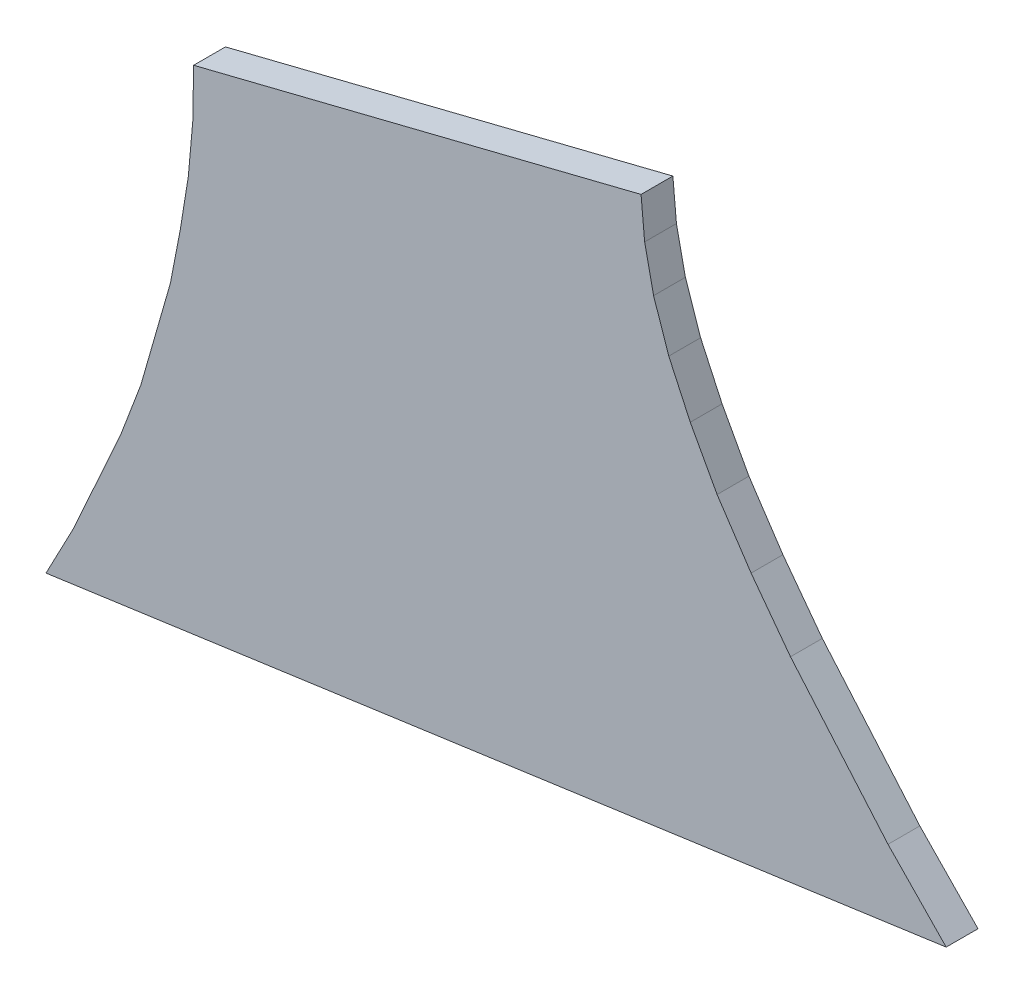
ISO-10303-21;
HEADER;
FILE_DESCRIPTION(('STEP AP214'),'2;1');
FILE_NAME('part.step','',(''),(''),'','','');
FILE_SCHEMA(('AUTOMOTIVE_DESIGN { 1 0 10303 214 1 1 1 1 }'));
ENDSEC;
DATA;
#1=APPLICATION_CONTEXT('core data for automotive mechanical design processes');
#2=APPLICATION_PROTOCOL_DEFINITION('international standard','automotive_design',2000,#1);
#3=PRODUCT_CONTEXT('',#1,'mechanical');
#4=PRODUCT('Part','Part','',(#3));
#5=PRODUCT_RELATED_PRODUCT_CATEGORY('part','',(#4));
#6=PRODUCT_DEFINITION_FORMATION('','',#4);
#7=PRODUCT_DEFINITION_CONTEXT('part definition',#1,'design');
#8=PRODUCT_DEFINITION('design','',#6,#7);
#9=PRODUCT_DEFINITION_SHAPE('','',#8);
#10=(LENGTH_UNIT() NAMED_UNIT(*) SI_UNIT(.MILLI.,.METRE.));
#11=(NAMED_UNIT(*) PLANE_ANGLE_UNIT() SI_UNIT($,.RADIAN.));
#12=(NAMED_UNIT(*) SI_UNIT($,.STERADIAN.) SOLID_ANGLE_UNIT());
#13=UNCERTAINTY_MEASURE_WITH_UNIT(LENGTH_MEASURE(1.E-05),#10,'distance_accuracy_value','');
#14=(GEOMETRIC_REPRESENTATION_CONTEXT(3) GLOBAL_UNCERTAINTY_ASSIGNED_CONTEXT((#13)) GLOBAL_UNIT_ASSIGNED_CONTEXT((#10,
#11,#12)) REPRESENTATION_CONTEXT('',''));
#15=CARTESIAN_POINT('',(0.,0.,0.));
#16=DIRECTION('',(0.,0.,1.));
#17=DIRECTION('',(1.,0.,0.));
#18=AXIS2_PLACEMENT_3D('',#15,#16,#17);
#19=CARTESIAN_POINT('',(88.6480026245117,106.698997497559,0.));
#20=DIRECTION('',(0.999834934997041,-0.0181687302655864,0.));
#21=DIRECTION('',(-0.0181687302655864,-0.999834934997041,0.));
#22=AXIS2_PLACEMENT_3D('',#19,#20,#21);
#23=PLANE('',#22);
#24=DIRECTION('',(-0.0181687302655864,-0.999834934997041,0.));
#25=VECTOR('',#24,1.);
#26=CARTESIAN_POINT('',(88.6480026245117,106.698997497559,0.03556));
#27=LINE('',#26,#25);
#28=CARTESIAN_POINT('',(88.6480026245117,106.698997497559,0.03556));
#29=VERTEX_POINT('',#28);
#30=CARTESIAN_POINT('',(88.6470031738281,106.643997192383,0.03556));
#31=VERTEX_POINT('',#30);
#32=EDGE_CURVE('E11',#29,#31,#27,.T.);
#33=ORIENTED_EDGE('',*,*,#32,.F.);
#34=DIRECTION('',(0.,0.,1.));
#35=VECTOR('',#34,1.);
#36=CARTESIAN_POINT('',(88.6480026245117,106.698997497559,0.));
#37=LINE('',#36,#35);
#38=CARTESIAN_POINT('',(88.6480026245117,106.698997497559,0.));
#39=VERTEX_POINT('',#38);
#40=EDGE_CURVE('E24',#39,#29,#37,.T.);
#41=ORIENTED_EDGE('',*,*,#40,.F.);
#42=DIRECTION('',(-0.0181687302655864,-0.999834934997041,0.));
#43=VECTOR('',#42,1.);
#44=CARTESIAN_POINT('',(88.6480026245117,106.698997497559,0.));
#45=LINE('',#44,#43);
#46=CARTESIAN_POINT('',(88.6470031738281,106.643997192383,0.));
#47=VERTEX_POINT('',#46);
#48=EDGE_CURVE('E166',#39,#47,#45,.T.);
#49=ORIENTED_EDGE('',*,*,#48,.T.);
#50=DIRECTION('',(0.,0.,1.));
#51=VECTOR('',#50,1.);
#52=CARTESIAN_POINT('',(88.6470031738281,106.643997192383,0.));
#53=LINE('',#52,#51);
#54=EDGE_CURVE('E37',#47,#31,#53,.T.);
#55=ORIENTED_EDGE('',*,*,#54,.T.);
#56=EDGE_LOOP('',(#33,#41,#49,#55));
#57=FACE_BOUND('',#56,.T.);
#58=ADVANCED_FACE('F17',(#57),#23,.F.);
#59=CARTESIAN_POINT('',(88.6470031738281,106.643997192383,0.));
#60=DIRECTION('',(0.996029974315315,-0.089018482718099,0.));
#61=DIRECTION('',(-0.089018482718099,-0.996029974315315,0.));
#62=AXIS2_PLACEMENT_3D('',#59,#60,#61);
#63=PLANE('',#62);
#64=DIRECTION('',(-0.089018482718099,-0.996029974315315,0.));
#65=VECTOR('',#64,1.);
#66=CARTESIAN_POINT('',(88.6470031738281,106.643997192383,0.03556));
#67=LINE('',#66,#65);
#68=CARTESIAN_POINT('',(88.6419982910156,106.587997436523,0.03556));
#69=VERTEX_POINT('',#68);
#70=EDGE_CURVE('E294',#31,#69,#67,.T.);
#71=ORIENTED_EDGE('',*,*,#70,.F.);
#72=ORIENTED_EDGE('',*,*,#54,.F.);
#73=DIRECTION('',(-0.089018482718099,-0.996029974315315,0.));
#74=VECTOR('',#73,1.);
#75=CARTESIAN_POINT('',(88.6470031738281,106.643997192383,0.));
#76=LINE('',#75,#74);
#77=CARTESIAN_POINT('',(88.6419982910156,106.587997436523,0.));
#78=VERTEX_POINT('',#77);
#79=EDGE_CURVE('E291',#47,#78,#76,.T.);
#80=ORIENTED_EDGE('',*,*,#79,.T.);
#81=DIRECTION('',(0.,0.,1.));
#82=VECTOR('',#81,1.);
#83=CARTESIAN_POINT('',(88.6419982910156,106.587997436523,0.));
#84=LINE('',#83,#82);
#85=EDGE_CURVE('E289',#78,#69,#84,.T.);
#86=ORIENTED_EDGE('',*,*,#85,.T.);
#87=EDGE_LOOP('',(#71,#72,#80,#86));
#88=FACE_BOUND('',#87,.T.);
#89=ADVANCED_FACE('F302',(#88),#63,.F.);
#90=CARTESIAN_POINT('',(88.6419982910156,106.587997436524,0.));
#91=DIRECTION('',(0.987343915402215,-0.158593797855478,0.));
#92=DIRECTION('',(-0.158593797855478,-0.987343915402215,0.));
#93=AXIS2_PLACEMENT_3D('',#90,#91,#92);
#94=PLANE('',#93);
#95=DIRECTION('',(-0.158593797855478,-0.987343915402215,0.));
#96=VECTOR('',#95,1.);
#97=CARTESIAN_POINT('',(88.6419982910156,106.587997436523,0.03556));
#98=LINE('',#97,#96);
#99=CARTESIAN_POINT('',(88.6330032348633,106.531997680664,0.03556));
#100=VERTEX_POINT('',#99);
#101=EDGE_CURVE('E286',#69,#100,#98,.T.);
#102=ORIENTED_EDGE('',*,*,#101,.F.);
#103=ORIENTED_EDGE('',*,*,#85,.F.);
#104=DIRECTION('',(-0.158593797855478,-0.987343915402215,0.));
#105=VECTOR('',#104,1.);
#106=CARTESIAN_POINT('',(88.6419982910156,106.587997436523,0.));
#107=LINE('',#106,#105);
#108=CARTESIAN_POINT('',(88.6330032348633,106.531997680664,0.));
#109=VERTEX_POINT('',#108);
#110=EDGE_CURVE('E283',#78,#109,#107,.T.);
#111=ORIENTED_EDGE('',*,*,#110,.T.);
#112=DIRECTION('',(0.,0.,1.));
#113=VECTOR('',#112,1.);
#114=CARTESIAN_POINT('',(88.6330032348633,106.531997680664,0.));
#115=LINE('',#114,#113);
#116=EDGE_CURVE('E281',#109,#100,#115,.T.);
#117=ORIENTED_EDGE('',*,*,#116,.T.);
#118=EDGE_LOOP('',(#102,#103,#111,#117));
#119=FACE_BOUND('',#118,.T.);
#120=ADVANCED_FACE('F308',(#119),#94,.F.);
#121=CARTESIAN_POINT('',(88.6330032348633,106.531997680664,0.));
#122=DIRECTION('',(0.981877794410834,-0.189515162567317,0.));
#123=DIRECTION('',(-0.189515162567317,-0.981877794410834,0.));
#124=AXIS2_PLACEMENT_3D('',#121,#122,#123);
#125=PLANE('',#124);
#126=DIRECTION('',(-0.189515162567317,-0.981877794410834,0.));
#127=VECTOR('',#126,1.);
#128=CARTESIAN_POINT('',(88.6330032348633,106.531997680664,0.03556));
#129=LINE('',#128,#127);
#130=CARTESIAN_POINT('',(88.6220016479492,106.474998474121,0.03556));
#131=VERTEX_POINT('',#130);
#132=EDGE_CURVE('E278',#100,#131,#129,.T.);
#133=ORIENTED_EDGE('',*,*,#132,.F.);
#134=ORIENTED_EDGE('',*,*,#116,.F.);
#135=DIRECTION('',(-0.189515162567317,-0.981877794410834,0.));
#136=VECTOR('',#135,1.);
#137=CARTESIAN_POINT('',(88.6330032348633,106.531997680664,0.));
#138=LINE('',#137,#136);
#139=CARTESIAN_POINT('',(88.6220016479492,106.474998474121,0.));
#140=VERTEX_POINT('',#139);
#141=EDGE_CURVE('E275',#109,#140,#138,.T.);
#142=ORIENTED_EDGE('',*,*,#141,.T.);
#143=DIRECTION('',(0.,0.,1.));
#144=VECTOR('',#143,1.);
#145=CARTESIAN_POINT('',(88.6220016479492,106.474998474121,0.));
#146=LINE('',#145,#144);
#147=EDGE_CURVE('E273',#140,#131,#146,.T.);
#148=ORIENTED_EDGE('',*,*,#147,.T.);
#149=EDGE_LOOP('',(#133,#134,#142,#148));
#150=FACE_BOUND('',#149,.T.);
#151=ADVANCED_FACE('F310',(#150),#125,.F.);
#152=CARTESIAN_POINT('',(88.6220016479492,106.474998474121,0.));
#153=DIRECTION('',(0.961195996054474,-0.275866375567681,0.));
#154=DIRECTION('',(-0.275866375567681,-0.961195996054474,0.));
#155=AXIS2_PLACEMENT_3D('',#152,#153,#154);
#156=PLANE('',#155);
#157=DIRECTION('',(-0.275866375567681,-0.961195996054473,0.));
#158=VECTOR('',#157,1.);
#159=CARTESIAN_POINT('',(88.6220016479492,106.474998474121,0.03556));
#160=LINE('',#159,#158);
#161=CARTESIAN_POINT('',(88.588996887207,106.360000610352,0.03556));
#162=VERTEX_POINT('',#161);
#163=EDGE_CURVE('E270',#131,#162,#160,.T.);
#164=ORIENTED_EDGE('',*,*,#163,.F.);
#165=ORIENTED_EDGE('',*,*,#147,.F.);
#166=DIRECTION('',(-0.275866375567681,-0.961195996054473,0.));
#167=VECTOR('',#166,1.);
#168=CARTESIAN_POINT('',(88.6220016479492,106.474998474121,0.));
#169=LINE('',#168,#167);
#170=CARTESIAN_POINT('',(88.588996887207,106.360000610352,0.));
#171=VERTEX_POINT('',#170);
#172=EDGE_CURVE('E267',#140,#171,#169,.T.);
#173=ORIENTED_EDGE('',*,*,#172,.T.);
#174=DIRECTION('',(0.,0.,1.));
#175=VECTOR('',#174,1.);
#176=CARTESIAN_POINT('',(88.588996887207,106.360000610352,0.));
#177=LINE('',#176,#175);
#178=EDGE_CURVE('E265',#171,#162,#177,.T.);
#179=ORIENTED_EDGE('',*,*,#178,.T.);
#180=EDGE_LOOP('',(#164,#165,#173,#179));
#181=FACE_BOUND('',#180,.T.);
#182=ADVANCED_FACE('F315',(#181),#156,.F.);
#183=CARTESIAN_POINT('',(88.588996887207,106.360000610352,0.));
#184=DIRECTION('',(0.935018620719502,-0.354598616618564,0.));
#185=DIRECTION('',(-0.354598616618564,-0.935018620719502,0.));
#186=AXIS2_PLACEMENT_3D('',#183,#184,#185);
#187=PLANE('',#186);
#188=DIRECTION('',(-0.354598616618564,-0.935018620719502,0.));
#189=VECTOR('',#188,1.);
#190=CARTESIAN_POINT('',(88.588996887207,106.360000610352,0.03556));
#191=LINE('',#190,#189);
#192=CARTESIAN_POINT('',(88.5670013427734,106.302001953125,0.03556));
#193=VERTEX_POINT('',#192);
#194=EDGE_CURVE('E262',#162,#193,#191,.T.);
#195=ORIENTED_EDGE('',*,*,#194,.F.);
#196=ORIENTED_EDGE('',*,*,#178,.F.);
#197=DIRECTION('',(-0.354598616618564,-0.935018620719502,0.));
#198=VECTOR('',#197,1.);
#199=CARTESIAN_POINT('',(88.588996887207,106.360000610352,0.));
#200=LINE('',#199,#198);
#201=CARTESIAN_POINT('',(88.5670013427734,106.302001953125,0.));
#202=VERTEX_POINT('',#201);
#203=EDGE_CURVE('E259',#171,#202,#200,.T.);
#204=ORIENTED_EDGE('',*,*,#203,.T.);
#205=DIRECTION('',(0.,0.,1.));
#206=VECTOR('',#205,1.);
#207=CARTESIAN_POINT('',(88.5670013427734,106.302001953125,0.));
#208=LINE('',#207,#206);
#209=EDGE_CURVE('E257',#202,#193,#208,.T.);
#210=ORIENTED_EDGE('',*,*,#209,.T.);
#211=EDGE_LOOP('',(#195,#196,#204,#210));
#212=FACE_BOUND('',#211,.T.);
#213=ADVANCED_FACE('F318',(#212),#187,.F.);
#214=CARTESIAN_POINT('',(88.5670013427734,106.302001953125,0.));
#215=DIRECTION('',(0.912211507330292,-0.409719618634741,0.));
#216=DIRECTION('',(-0.409719618634741,-0.912211507330292,0.));
#217=AXIS2_PLACEMENT_3D('',#214,#215,#216);
#218=PLANE('',#217);
#219=DIRECTION('',(-0.409719618634741,-0.912211507330292,0.));
#220=VECTOR('',#219,1.);
#221=CARTESIAN_POINT('',(88.5670013427734,106.302001953125,0.03556));
#222=LINE('',#221,#220);
#223=CARTESIAN_POINT('',(88.5139999389648,106.18399810791,0.03556));
#224=VERTEX_POINT('',#223);
#225=EDGE_CURVE('E254',#193,#224,#222,.T.);
#226=ORIENTED_EDGE('',*,*,#225,.F.);
#227=ORIENTED_EDGE('',*,*,#209,.F.);
#228=DIRECTION('',(-0.409719618634741,-0.912211507330292,0.));
#229=VECTOR('',#228,1.);
#230=CARTESIAN_POINT('',(88.5670013427734,106.302001953125,0.));
#231=LINE('',#230,#229);
#232=CARTESIAN_POINT('',(88.5139999389648,106.18399810791,0.));
#233=VERTEX_POINT('',#232);
#234=EDGE_CURVE('E251',#202,#233,#231,.T.);
#235=ORIENTED_EDGE('',*,*,#234,.T.);
#236=DIRECTION('',(0.,0.,1.));
#237=VECTOR('',#236,1.);
#238=CARTESIAN_POINT('',(88.5139999389648,106.18399810791,0.));
#239=LINE('',#238,#237);
#240=EDGE_CURVE('E249',#233,#224,#239,.T.);
#241=ORIENTED_EDGE('',*,*,#240,.T.);
#242=EDGE_LOOP('',(#226,#227,#235,#241));
#243=FACE_BOUND('',#242,.T.);
#244=ADVANCED_FACE('F323',(#243),#218,.F.);
#245=CARTESIAN_POINT('',(88.5139999389648,106.18399810791,0.));
#246=DIRECTION('',(0.885248268877242,-0.465118804661611,0.));
#247=DIRECTION('',(-0.465118804661611,-0.885248268877242,0.));
#248=AXIS2_PLACEMENT_3D('',#245,#246,#247);
#249=PLANE('',#248);
#250=DIRECTION('',(-0.465118804661611,-0.885248268877242,0.));
#251=VECTOR('',#250,1.);
#252=CARTESIAN_POINT('',(88.5139999389648,106.18399810791,0.03556));
#253=LINE('',#252,#251);
#254=CARTESIAN_POINT('',(88.4830017089844,106.125,0.03556));
#255=VERTEX_POINT('',#254);
#256=EDGE_CURVE('E246',#224,#255,#253,.T.);
#257=ORIENTED_EDGE('',*,*,#256,.F.);
#258=ORIENTED_EDGE('',*,*,#240,.F.);
#259=DIRECTION('',(-0.465118804661611,-0.885248268877242,0.));
#260=VECTOR('',#259,1.);
#261=CARTESIAN_POINT('',(88.5139999389648,106.18399810791,0.));
#262=LINE('',#261,#260);
#263=CARTESIAN_POINT('',(88.4830017089844,106.125,0.));
#264=VERTEX_POINT('',#263);
#265=EDGE_CURVE('E243',#233,#264,#262,.T.);
#266=ORIENTED_EDGE('',*,*,#265,.T.);
#267=DIRECTION('',(0.,0.,1.));
#268=VECTOR('',#267,1.);
#269=CARTESIAN_POINT('',(88.4830017089844,106.125,0.));
#270=LINE('',#269,#268);
#271=EDGE_CURVE('E241',#264,#255,#270,.T.);
#272=ORIENTED_EDGE('',*,*,#271,.T.);
#273=EDGE_LOOP('',(#257,#258,#266,#272));
#274=FACE_BOUND('',#273,.T.);
#275=ADVANCED_FACE('F326',(#274),#249,.F.);
#276=CARTESIAN_POINT('',(88.4830017089844,106.125,0.));
#277=DIRECTION('',(-0.138801647638479,0.990320202062365,0.));
#278=DIRECTION('',(0.990320202062365,0.138801647638479,0.));
#279=AXIS2_PLACEMENT_3D('',#276,#277,#278);
#280=PLANE('',#279);
#281=DIRECTION('',(0.990320202062365,0.138801647638479,0.));
#282=VECTOR('',#281,1.);
#283=CARTESIAN_POINT('',(88.4830017089844,106.125,0.03556));
#284=LINE('',#283,#282);
#285=CARTESIAN_POINT('',(89.4889984130859,106.265998840332,0.03556));
#286=VERTEX_POINT('',#285);
#287=EDGE_CURVE('E238',#255,#286,#284,.T.);
#288=ORIENTED_EDGE('',*,*,#287,.F.);
#289=ORIENTED_EDGE('',*,*,#271,.F.);
#290=DIRECTION('',(0.990320202062365,0.138801647638479,0.));
#291=VECTOR('',#290,1.);
#292=CARTESIAN_POINT('',(88.4830017089844,106.125,0.));
#293=LINE('',#292,#291);
#294=CARTESIAN_POINT('',(89.4889984130859,106.265998840332,0.));
#295=VERTEX_POINT('',#294);
#296=EDGE_CURVE('E235',#264,#295,#293,.T.);
#297=ORIENTED_EDGE('',*,*,#296,.T.);
#298=DIRECTION('',(0.,0.,1.));
#299=VECTOR('',#298,1.);
#300=CARTESIAN_POINT('',(89.4889984130859,106.265998840332,0.));
#301=LINE('',#300,#299);
#302=EDGE_CURVE('E233',#295,#286,#301,.T.);
#303=ORIENTED_EDGE('',*,*,#302,.T.);
#304=EDGE_LOOP('',(#288,#289,#297,#303));
#305=FACE_BOUND('',#304,.T.);
#306=ADVANCED_FACE('F331',(#305),#280,.F.);
#307=CARTESIAN_POINT('',(89.4889984130859,106.265998840332,0.));
#308=DIRECTION('',(-0.71777288988445,-0.696277300037079,0.));
#309=DIRECTION('',(-0.696277300037079,0.71777288988445,0.));
#310=AXIS2_PLACEMENT_3D('',#307,#308,#309);
#311=PLANE('',#310);
#312=DIRECTION('',(-0.696277300037079,0.71777288988445,0.));
#313=VECTOR('',#312,1.);
#314=CARTESIAN_POINT('',(89.4889984130859,106.265998840332,0.03556));
#315=LINE('',#314,#313);
#316=CARTESIAN_POINT('',(89.4240036010742,106.333000183105,0.03556));
#317=VERTEX_POINT('',#316);
#318=EDGE_CURVE('E230',#286,#317,#315,.T.);
#319=ORIENTED_EDGE('',*,*,#318,.F.);
#320=ORIENTED_EDGE('',*,*,#302,.F.);
#321=DIRECTION('',(-0.696277300037079,0.71777288988445,0.));
#322=VECTOR('',#321,1.);
#323=CARTESIAN_POINT('',(89.4889984130859,106.265998840332,0.));
#324=LINE('',#323,#322);
#325=CARTESIAN_POINT('',(89.4240036010742,106.333000183105,0.));
#326=VERTEX_POINT('',#325);
#327=EDGE_CURVE('E227',#295,#326,#324,.T.);
#328=ORIENTED_EDGE('',*,*,#327,.T.);
#329=DIRECTION('',(0.,0.,1.));
#330=VECTOR('',#329,1.);
#331=CARTESIAN_POINT('',(89.4240036010742,106.333000183105,0.));
#332=LINE('',#331,#330);
#333=EDGE_CURVE('E225',#326,#317,#332,.T.);
#334=ORIENTED_EDGE('',*,*,#333,.T.);
#335=EDGE_LOOP('',(#319,#320,#328,#334));
#336=FACE_BOUND('',#335,.T.);
#337=ADVANCED_FACE('F334',(#336),#311,.F.);
#338=CARTESIAN_POINT('',(89.4240036010742,106.333000183105,0.));
#339=DIRECTION('',(-0.758828463890867,-0.65129053608127,0.));
#340=DIRECTION('',(-0.65129053608127,0.758828463890867,0.));
#341=AXIS2_PLACEMENT_3D('',#338,#339,#340);
#342=PLANE('',#341);
#343=DIRECTION('',(-0.65129053608127,0.758828463890867,0.));
#344=VECTOR('',#343,1.);
#345=CARTESIAN_POINT('',(89.4240036010742,106.333000183105,0.03556));
#346=LINE('',#345,#344);
#347=CARTESIAN_POINT('',(89.3150024414062,106.459999084473,0.03556));
#348=VERTEX_POINT('',#347);
#349=EDGE_CURVE('E222',#317,#348,#346,.T.);
#350=ORIENTED_EDGE('',*,*,#349,.F.);
#351=ORIENTED_EDGE('',*,*,#333,.F.);
#352=DIRECTION('',(-0.65129053608127,0.758828463890867,0.));
#353=VECTOR('',#352,1.);
#354=CARTESIAN_POINT('',(89.4240036010742,106.333000183105,0.));
#355=LINE('',#354,#353);
#356=CARTESIAN_POINT('',(89.3150024414062,106.459999084473,0.));
#357=VERTEX_POINT('',#356);
#358=EDGE_CURVE('E219',#326,#357,#355,.T.);
#359=ORIENTED_EDGE('',*,*,#358,.T.);
#360=DIRECTION('',(0.,0.,1.));
#361=VECTOR('',#360,1.);
#362=CARTESIAN_POINT('',(89.3150024414062,106.459999084473,0.));
#363=LINE('',#362,#361);
#364=EDGE_CURVE('E217',#357,#348,#363,.T.);
#365=ORIENTED_EDGE('',*,*,#364,.T.);
#366=EDGE_LOOP('',(#350,#351,#359,#365));
#367=FACE_BOUND('',#366,.T.);
#368=ADVANCED_FACE('F339',(#367),#342,.F.);
#369=CARTESIAN_POINT('',(89.3150024414062,106.459999084473,0.));
#370=DIRECTION('',(-0.80162663308087,-0.597825008790557,0.));
#371=DIRECTION('',(-0.597825008790557,0.80162663308087,0.));
#372=AXIS2_PLACEMENT_3D('',#369,#370,#371);
#373=PLANE('',#372);
#374=DIRECTION('',(-0.597825008790557,0.80162663308087,0.));
#375=VECTOR('',#374,1.);
#376=CARTESIAN_POINT('',(89.3150024414062,106.459999084473,0.03556));
#377=LINE('',#376,#375);
#378=CARTESIAN_POINT('',(89.2710037231445,106.518997192383,0.03556));
#379=VERTEX_POINT('',#378);
#380=EDGE_CURVE('E214',#348,#379,#377,.T.);
#381=ORIENTED_EDGE('',*,*,#380,.F.);
#382=ORIENTED_EDGE('',*,*,#364,.F.);
#383=DIRECTION('',(-0.597825008790557,0.80162663308087,0.));
#384=VECTOR('',#383,1.);
#385=CARTESIAN_POINT('',(89.3150024414062,106.459999084473,0.));
#386=LINE('',#385,#384);
#387=CARTESIAN_POINT('',(89.2710037231445,106.518997192383,0.));
#388=VERTEX_POINT('',#387);
#389=EDGE_CURVE('E211',#357,#388,#386,.T.);
#390=ORIENTED_EDGE('',*,*,#389,.T.);
#391=DIRECTION('',(0.,0.,1.));
#392=VECTOR('',#391,1.);
#393=CARTESIAN_POINT('',(89.2710037231445,106.518997192383,0.));
#394=LINE('',#393,#392);
#395=EDGE_CURVE('E209',#388,#379,#394,.T.);
#396=ORIENTED_EDGE('',*,*,#395,.T.);
#397=EDGE_LOOP('',(#381,#382,#390,#396));
#398=FACE_BOUND('',#397,.T.);
#399=ADVANCED_FACE('F342',(#398),#373,.F.);
#400=CARTESIAN_POINT('',(89.2710037231445,106.518997192383,0.));
#401=DIRECTION('',(-0.83203316034414,-0.554725896355797,0.));
#402=DIRECTION('',(-0.554725896355797,0.83203316034414,0.));
#403=AXIS2_PLACEMENT_3D('',#400,#401,#402);
#404=PLANE('',#403);
#405=DIRECTION('',(-0.554725896355797,0.83203316034414,0.));
#406=VECTOR('',#405,1.);
#407=CARTESIAN_POINT('',(89.2710037231445,106.518997192383,0.03556));
#408=LINE('',#407,#406);
#409=CARTESIAN_POINT('',(89.2330017089844,106.575996398926,0.03556));
#410=VERTEX_POINT('',#409);
#411=EDGE_CURVE('E206',#379,#410,#408,.T.);
#412=ORIENTED_EDGE('',*,*,#411,.F.);
#413=ORIENTED_EDGE('',*,*,#395,.F.);
#414=DIRECTION('',(-0.554725896355797,0.83203316034414,0.));
#415=VECTOR('',#414,1.);
#416=CARTESIAN_POINT('',(89.2710037231445,106.518997192383,0.));
#417=LINE('',#416,#415);
#418=CARTESIAN_POINT('',(89.2330017089844,106.575996398926,0.));
#419=VERTEX_POINT('',#418);
#420=EDGE_CURVE('E203',#388,#419,#417,.T.);
#421=ORIENTED_EDGE('',*,*,#420,.T.);
#422=DIRECTION('',(0.,0.,1.));
#423=VECTOR('',#422,1.);
#424=CARTESIAN_POINT('',(89.2330017089844,106.575996398926,0.));
#425=LINE('',#424,#423);
#426=EDGE_CURVE('E201',#419,#410,#425,.T.);
#427=ORIENTED_EDGE('',*,*,#426,.T.);
#428=EDGE_LOOP('',(#412,#413,#421,#427));
#429=FACE_BOUND('',#428,.T.);
#430=ADVANCED_FACE('F347',(#429),#404,.F.);
#431=CARTESIAN_POINT('',(89.2330017089844,106.575996398926,0.));
#432=DIRECTION('',(-0.877904880698317,-0.478835066015506,0.));
#433=DIRECTION('',(-0.478835066015506,0.877904880698317,0.));
#434=AXIS2_PLACEMENT_3D('',#431,#432,#433);
#435=PLANE('',#434);
#436=DIRECTION('',(-0.478835066015506,0.877904880698317,0.));
#437=VECTOR('',#436,1.);
#438=CARTESIAN_POINT('',(89.2330017089844,106.575996398926,0.03556));
#439=LINE('',#438,#437);
#440=CARTESIAN_POINT('',(89.2030029296875,106.630996704102,0.03556));
#441=VERTEX_POINT('',#440);
#442=EDGE_CURVE('E198',#410,#441,#439,.T.);
#443=ORIENTED_EDGE('',*,*,#442,.F.);
#444=ORIENTED_EDGE('',*,*,#426,.F.);
#445=DIRECTION('',(-0.478835066015506,0.877904880698317,0.));
#446=VECTOR('',#445,1.);
#447=CARTESIAN_POINT('',(89.2330017089844,106.575996398926,0.));
#448=LINE('',#447,#446);
#449=CARTESIAN_POINT('',(89.2030029296875,106.630996704102,0.));
#450=VERTEX_POINT('',#449);
#451=EDGE_CURVE('E195',#419,#450,#448,.T.);
#452=ORIENTED_EDGE('',*,*,#451,.T.);
#453=DIRECTION('',(0.,0.,1.));
#454=VECTOR('',#453,1.);
#455=CARTESIAN_POINT('',(89.2030029296875,106.630996704102,0.));
#456=LINE('',#455,#454);
#457=EDGE_CURVE('E193',#450,#441,#456,.T.);
#458=ORIENTED_EDGE('',*,*,#457,.T.);
#459=EDGE_LOOP('',(#443,#444,#452,#458));
#460=FACE_BOUND('',#459,.T.);
#461=ADVANCED_FACE('F350',(#460),#435,.F.);
#462=CARTESIAN_POINT('',(89.2030029296875,106.630996704102,0.));
#463=DIRECTION('',(-0.907951586751489,-0.419075072171388,0.));
#464=DIRECTION('',(-0.419075072171388,0.907951586751489,0.));
#465=AXIS2_PLACEMENT_3D('',#462,#463,#464);
#466=PLANE('',#465);
#467=DIRECTION('',(-0.419075072171388,0.907951586751489,0.));
#468=VECTOR('',#467,1.);
#469=CARTESIAN_POINT('',(89.2030029296875,106.630996704102,0.03556));
#470=LINE('',#469,#468);
#471=CARTESIAN_POINT('',(89.1790008544922,106.682998657227,0.03556));
#472=VERTEX_POINT('',#471);
#473=EDGE_CURVE('E190',#441,#472,#470,.T.);
#474=ORIENTED_EDGE('',*,*,#473,.F.);
#475=ORIENTED_EDGE('',*,*,#457,.F.);
#476=DIRECTION('',(-0.419075072171388,0.907951586751489,0.));
#477=VECTOR('',#476,1.);
#478=CARTESIAN_POINT('',(89.2030029296875,106.630996704102,0.));
#479=LINE('',#478,#477);
#480=CARTESIAN_POINT('',(89.1790008544922,106.682998657227,0.));
#481=VERTEX_POINT('',#480);
#482=EDGE_CURVE('E187',#450,#481,#479,.T.);
#483=ORIENTED_EDGE('',*,*,#482,.T.);
#484=DIRECTION('',(0.,0.,1.));
#485=VECTOR('',#484,1.);
#486=CARTESIAN_POINT('',(89.1790008544922,106.682998657227,0.));
#487=LINE('',#486,#485);
#488=EDGE_CURVE('E185',#481,#472,#487,.T.);
#489=ORIENTED_EDGE('',*,*,#488,.T.);
#490=EDGE_LOOP('',(#474,#475,#483,#489));
#491=FACE_BOUND('',#490,.T.);
#492=ADVANCED_FACE('F355',(#491),#466,.F.);
#493=CARTESIAN_POINT('',(89.1790008544922,106.682998657227,0.));
#494=DIRECTION('',(-0.946788593315352,-0.321856116250626,0.));
#495=DIRECTION('',(-0.321856116250626,0.946788593315352,0.));
#496=AXIS2_PLACEMENT_3D('',#493,#494,#495);
#497=PLANE('',#496);
#498=DIRECTION('',(-0.321856116250626,0.946788593315352,0.));
#499=VECTOR('',#498,1.);
#500=CARTESIAN_POINT('',(89.1790008544922,106.682998657227,0.03556));
#501=LINE('',#500,#499);
#502=CARTESIAN_POINT('',(89.1620025634766,106.733001708984,0.03556));
#503=VERTEX_POINT('',#502);
#504=EDGE_CURVE('E182',#472,#503,#501,.T.);
#505=ORIENTED_EDGE('',*,*,#504,.F.);
#506=ORIENTED_EDGE('',*,*,#488,.F.);
#507=DIRECTION('',(-0.321856116250626,0.946788593315352,0.));
#508=VECTOR('',#507,1.);
#509=CARTESIAN_POINT('',(89.1790008544922,106.682998657227,0.));
#510=LINE('',#509,#508);
#511=CARTESIAN_POINT('',(89.1620025634766,106.733001708984,0.));
#512=VERTEX_POINT('',#511);
#513=EDGE_CURVE('E179',#481,#512,#510,.T.);
#514=ORIENTED_EDGE('',*,*,#513,.T.);
#515=DIRECTION('',(0.,0.,1.));
#516=VECTOR('',#515,1.);
#517=CARTESIAN_POINT('',(89.1620025634766,106.733001708984,0.));
#518=LINE('',#517,#516);
#519=EDGE_CURVE('E177',#512,#503,#518,.T.);
#520=ORIENTED_EDGE('',*,*,#519,.T.);
#521=EDGE_LOOP('',(#505,#506,#514,#520));
#522=FACE_BOUND('',#521,.T.);
#523=ADVANCED_FACE('F358',(#522),#497,.F.);
#524=CARTESIAN_POINT('',(89.1620025634766,106.733001708984,0.));
#525=DIRECTION('',(-0.978094237159911,-0.208162588460494,0.));
#526=DIRECTION('',(-0.208162588460494,0.978094237159911,0.));
#527=AXIS2_PLACEMENT_3D('',#524,#525,#526);
#528=PLANE('',#527);
#529=DIRECTION('',(-0.208162588460494,0.978094237159911,0.));
#530=VECTOR('',#529,1.);
#531=CARTESIAN_POINT('',(89.1620025634766,106.733001708984,0.03556));
#532=LINE('',#531,#530);
#533=CARTESIAN_POINT('',(89.1520004272461,106.779998779297,0.03556));
#534=VERTEX_POINT('',#533);
#535=EDGE_CURVE('E174',#503,#534,#532,.T.);
#536=ORIENTED_EDGE('',*,*,#535,.F.);
#537=ORIENTED_EDGE('',*,*,#519,.F.);
#538=DIRECTION('',(-0.208162588460494,0.978094237159911,0.));
#539=VECTOR('',#538,1.);
#540=CARTESIAN_POINT('',(89.1620025634766,106.733001708984,0.));
#541=LINE('',#540,#539);
#542=CARTESIAN_POINT('',(89.1520004272461,106.779998779297,0.));
#543=VERTEX_POINT('',#542);
#544=EDGE_CURVE('E172',#512,#543,#541,.T.);
#545=ORIENTED_EDGE('',*,*,#544,.T.);
#546=DIRECTION('',(0.,0.,1.));
#547=VECTOR('',#546,1.);
#548=CARTESIAN_POINT('',(89.1520004272461,106.779998779297,0.));
#549=LINE('',#548,#547);
#550=EDGE_CURVE('E157',#543,#534,#549,.T.);
#551=ORIENTED_EDGE('',*,*,#550,.T.);
#552=EDGE_LOOP('',(#536,#537,#545,#551));
#553=FACE_BOUND('',#552,.T.);
#554=ADVANCED_FACE('F361',(#553),#528,.F.);
#555=CARTESIAN_POINT('',(89.1520004272461,106.779998779297,0.));
#556=DIRECTION('',(-0.99589745182302,-0.0904890349844395,0.));
#557=DIRECTION('',(-0.0904890349844395,0.99589745182302,0.));
#558=AXIS2_PLACEMENT_3D('',#555,#556,#557);
#559=PLANE('',#558);
#560=DIRECTION('',(-0.0904890349844395,0.99589745182302,0.));
#561=VECTOR('',#560,1.);
#562=CARTESIAN_POINT('',(89.1520004272461,106.779998779297,0.03556));
#563=LINE('',#562,#561);
#564=CARTESIAN_POINT('',(89.1480026245117,106.823997497559,0.03556));
#565=VERTEX_POINT('',#564);
#566=EDGE_CURVE('E161',#534,#565,#563,.T.);
#567=ORIENTED_EDGE('',*,*,#566,.F.);
#568=ORIENTED_EDGE('',*,*,#550,.F.);
#569=DIRECTION('',(-0.0904890349844395,0.99589745182302,0.));
#570=VECTOR('',#569,1.);
#571=CARTESIAN_POINT('',(89.1520004272461,106.779998779297,0.));
#572=LINE('',#571,#570);
#573=CARTESIAN_POINT('',(89.1480026245117,106.823997497559,0.));
#574=VERTEX_POINT('',#573);
#575=EDGE_CURVE('E153',#543,#574,#572,.T.);
#576=ORIENTED_EDGE('',*,*,#575,.T.);
#577=DIRECTION('',(0.,0.,1.));
#578=VECTOR('',#577,1.);
#579=CARTESIAN_POINT('',(89.1480026245117,106.823997497559,0.));
#580=LINE('',#579,#578);
#581=EDGE_CURVE('E143',#574,#565,#580,.T.);
#582=ORIENTED_EDGE('',*,*,#581,.T.);
#583=EDGE_LOOP('',(#567,#568,#576,#582));
#584=FACE_BOUND('',#583,.T.);
#585=ADVANCED_FACE('F156',(#584),#559,.F.);
#586=CARTESIAN_POINT('',(89.1480026245117,106.823997497559,0.));
#587=DIRECTION('',(0.242535625036333,-0.970142500145332,0.));
#588=DIRECTION('',(-0.970142500145332,-0.242535625036333,0.));
#589=AXIS2_PLACEMENT_3D('',#586,#587,#588);
#590=PLANE('',#589);
#591=DIRECTION('',(-0.970142500145332,-0.242535625036333,0.));
#592=VECTOR('',#591,1.);
#593=CARTESIAN_POINT('',(89.1480026245117,106.823997497559,0.03556));
#594=LINE('',#593,#592);
#595=EDGE_CURVE('E149',#565,#29,#594,.T.);
#596=ORIENTED_EDGE('',*,*,#595,.F.);
#597=ORIENTED_EDGE('',*,*,#581,.F.);
#598=DIRECTION('',(-0.970142500145332,-0.242535625036333,0.));
#599=VECTOR('',#598,1.);
#600=CARTESIAN_POINT('',(89.1480026245117,106.823997497559,0.));
#601=LINE('',#600,#599);
#602=EDGE_CURVE('E147',#574,#39,#601,.T.);
#603=ORIENTED_EDGE('',*,*,#602,.T.);
#604=ORIENTED_EDGE('',*,*,#40,.T.);
#605=EDGE_LOOP('',(#596,#597,#603,#604));
#606=FACE_BOUND('',#605,.T.);
#607=ADVANCED_FACE('F145',(#606),#590,.F.);
#608=CARTESIAN_POINT('',(88.6480026245117,106.698997497559,0.));
#609=DIRECTION('',(0.,0.,1.));
#610=DIRECTION('',(1.,0.,0.));
#611=AXIS2_PLACEMENT_3D('',#608,#609,#610);
#612=PLANE('',#611);
#613=ORIENTED_EDGE('',*,*,#602,.F.);
#614=ORIENTED_EDGE('',*,*,#575,.F.);
#615=ORIENTED_EDGE('',*,*,#544,.F.);
#616=ORIENTED_EDGE('',*,*,#513,.F.);
#617=ORIENTED_EDGE('',*,*,#482,.F.);
#618=ORIENTED_EDGE('',*,*,#451,.F.);
#619=ORIENTED_EDGE('',*,*,#420,.F.);
#620=ORIENTED_EDGE('',*,*,#389,.F.);
#621=ORIENTED_EDGE('',*,*,#358,.F.);
#622=ORIENTED_EDGE('',*,*,#327,.F.);
#623=ORIENTED_EDGE('',*,*,#296,.F.);
#624=ORIENTED_EDGE('',*,*,#265,.F.);
#625=ORIENTED_EDGE('',*,*,#234,.F.);
#626=ORIENTED_EDGE('',*,*,#203,.F.);
#627=ORIENTED_EDGE('',*,*,#172,.F.);
#628=ORIENTED_EDGE('',*,*,#141,.F.);
#629=ORIENTED_EDGE('',*,*,#110,.F.);
#630=ORIENTED_EDGE('',*,*,#79,.F.);
#631=ORIENTED_EDGE('',*,*,#48,.F.);
#632=EDGE_LOOP('',(#613,#614,#615,#616,#617,#618,#619,#620,#621,#622,#623,#624,#625,#626,#627,
#628,#629,#630,#631));
#633=FACE_BOUND('',#632,.T.);
#634=ADVANCED_FACE('F164',(#633),#612,.F.);
#635=CARTESIAN_POINT('',(88.6480026245117,106.698997497559,0.03556));
#636=DIRECTION('',(0.,0.,1.));
#637=DIRECTION('',(1.,0.,0.));
#638=AXIS2_PLACEMENT_3D('',#635,#636,#637);
#639=PLANE('',#638);
#640=ORIENTED_EDGE('',*,*,#32,.T.);
#641=ORIENTED_EDGE('',*,*,#70,.T.);
#642=ORIENTED_EDGE('',*,*,#101,.T.);
#643=ORIENTED_EDGE('',*,*,#132,.T.);
#644=ORIENTED_EDGE('',*,*,#163,.T.);
#645=ORIENTED_EDGE('',*,*,#194,.T.);
#646=ORIENTED_EDGE('',*,*,#225,.T.);
#647=ORIENTED_EDGE('',*,*,#256,.T.);
#648=ORIENTED_EDGE('',*,*,#287,.T.);
#649=ORIENTED_EDGE('',*,*,#318,.T.);
#650=ORIENTED_EDGE('',*,*,#349,.T.);
#651=ORIENTED_EDGE('',*,*,#380,.T.);
#652=ORIENTED_EDGE('',*,*,#411,.T.);
#653=ORIENTED_EDGE('',*,*,#442,.T.);
#654=ORIENTED_EDGE('',*,*,#473,.T.);
#655=ORIENTED_EDGE('',*,*,#504,.T.);
#656=ORIENTED_EDGE('',*,*,#535,.T.);
#657=ORIENTED_EDGE('',*,*,#566,.T.);
#658=ORIENTED_EDGE('',*,*,#595,.T.);
#659=EDGE_LOOP('',(#640,#641,#642,#643,#644,#645,#646,#647,#648,#649,#650,#651,#652,#653,#654,
#655,#656,#657,#658));
#660=FACE_BOUND('',#659,.T.);
#661=ADVANCED_FACE('F305',(#660),#639,.T.);
#662=CLOSED_SHELL('',(#58,#89,#120,#151,#182,#213,#244,#275,#306,#337,#368,#399,#430,#461,#492,
#523,#554,#585,#607,#634,#661));
#663=MANIFOLD_SOLID_BREP('B1',#662);
#664=ADVANCED_BREP_SHAPE_REPRESENTATION('',(#18,#663),#14);
#665=SHAPE_DEFINITION_REPRESENTATION(#9,#664);
ENDSEC;
END-ISO-10303-21;
